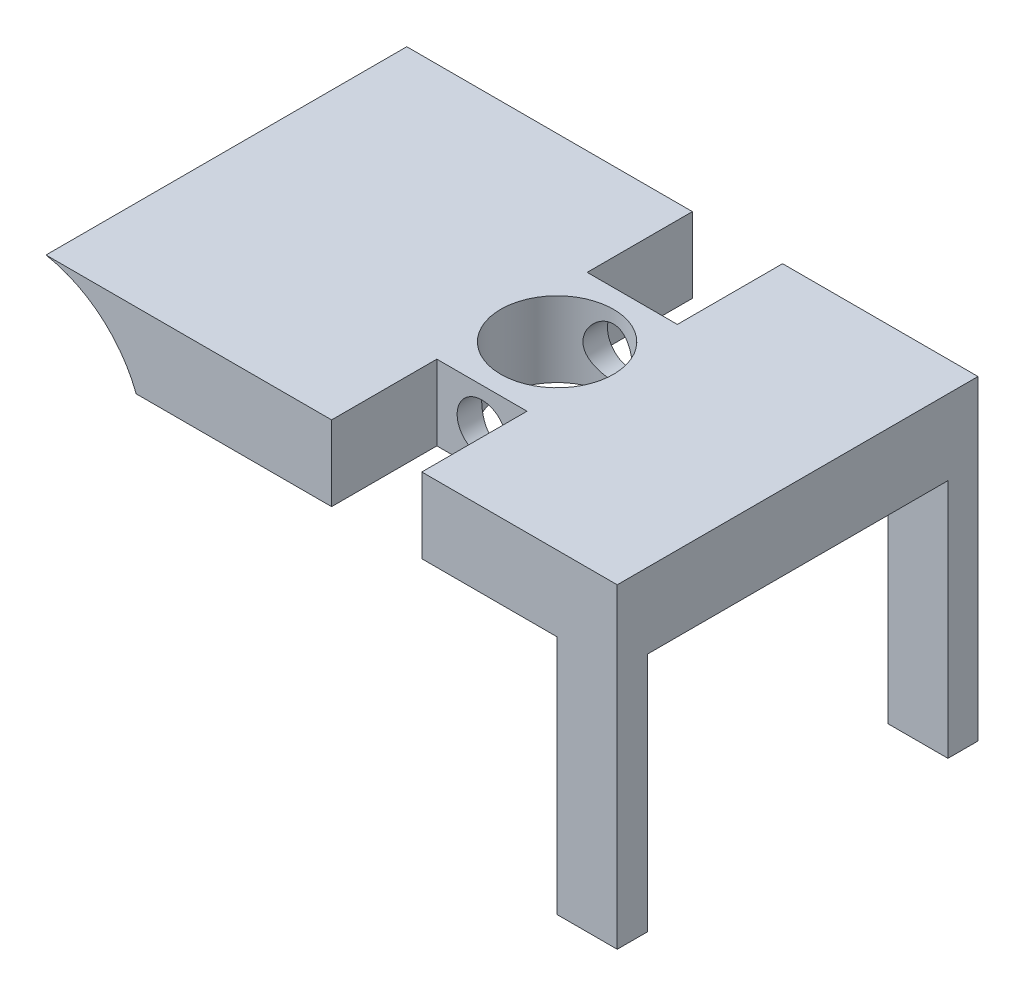
ISO-10303-21;
HEADER;
FILE_DESCRIPTION(('STEP AP214'),'2;1');
FILE_NAME('part.step','',(''),(''),'','','');
FILE_SCHEMA(('AUTOMOTIVE_DESIGN { 1 0 10303 214 1 1 1 1 }'));
ENDSEC;
DATA;
#1=APPLICATION_CONTEXT('core data for automotive mechanical design processes');
#2=APPLICATION_PROTOCOL_DEFINITION('international standard','automotive_design',2000,#1);
#3=PRODUCT_CONTEXT('',#1,'mechanical');
#4=PRODUCT('Part','Part','',(#3));
#5=PRODUCT_RELATED_PRODUCT_CATEGORY('part','',(#4));
#6=PRODUCT_DEFINITION_FORMATION('','',#4);
#7=PRODUCT_DEFINITION_CONTEXT('part definition',#1,'design');
#8=PRODUCT_DEFINITION('design','',#6,#7);
#9=PRODUCT_DEFINITION_SHAPE('','',#8);
#10=(LENGTH_UNIT() NAMED_UNIT(*) SI_UNIT(.MILLI.,.METRE.));
#11=(NAMED_UNIT(*) PLANE_ANGLE_UNIT() SI_UNIT($,.RADIAN.));
#12=(NAMED_UNIT(*) SI_UNIT($,.STERADIAN.) SOLID_ANGLE_UNIT());
#13=UNCERTAINTY_MEASURE_WITH_UNIT(LENGTH_MEASURE(1.E-05),#10,'distance_accuracy_value','');
#14=(GEOMETRIC_REPRESENTATION_CONTEXT(3) GLOBAL_UNCERTAINTY_ASSIGNED_CONTEXT((#13)) GLOBAL_UNIT_ASSIGNED_CONTEXT((#10,
#11,#12)) REPRESENTATION_CONTEXT('',''));
#15=CARTESIAN_POINT('',(0.,0.,0.));
#16=DIRECTION('',(0.,0.,1.));
#17=DIRECTION('',(1.,0.,0.));
#18=AXIS2_PLACEMENT_3D('',#15,#16,#17);
#19=CARTESIAN_POINT('',(15.,-18.5,-28.4924225024706));
#20=DIRECTION('',(-1.,0.,0.));
#21=DIRECTION('',(0.,-1.,0.));
#22=AXIS2_PLACEMENT_3D('',#19,#20,#21);
#23=PLANE('',#22);
#24=DIRECTION('',(0.,-1.,0.));
#25=VECTOR('',#24,1.);
#26=CARTESIAN_POINT('',(15.,-18.5,-10.));
#27=LINE('',#26,#25);
#28=CARTESIAN_POINT('',(15.,-2.50000000000001,-10.));
#29=VERTEX_POINT('',#28);
#30=CARTESIAN_POINT('',(15.,-18.5,-10.));
#31=VERTEX_POINT('',#30);
#32=EDGE_CURVE('E178',#29,#31,#27,.T.);
#33=ORIENTED_EDGE('',*,*,#32,.F.);
#34=DIRECTION('',(0.,0.,1.));
#35=VECTOR('',#34,1.);
#36=CARTESIAN_POINT('',(15.,-2.50000000000001,-28.4924225024706));
#37=LINE('',#36,#35);
#38=CARTESIAN_POINT('',(15.,-2.50000000000001,-12.));
#39=VERTEX_POINT('',#38);
#40=EDGE_CURVE('E203',#39,#29,#37,.T.);
#41=ORIENTED_EDGE('',*,*,#40,.F.);
#42=DIRECTION('',(0.,-1.,0.));
#43=VECTOR('',#42,1.);
#44=CARTESIAN_POINT('',(15.,-18.5,-12.));
#45=LINE('',#44,#43);
#46=CARTESIAN_POINT('',(15.,-18.5,-12.));
#47=VERTEX_POINT('',#46);
#48=EDGE_CURVE('E638',#39,#47,#45,.T.);
#49=ORIENTED_EDGE('',*,*,#48,.T.);
#50=DIRECTION('',(0.,0.,1.));
#51=VECTOR('',#50,1.);
#52=CARTESIAN_POINT('',(15.,-18.5,-28.4924225024706));
#53=LINE('',#52,#51);
#54=EDGE_CURVE('E208',#47,#31,#53,.T.);
#55=ORIENTED_EDGE('',*,*,#54,.T.);
#56=EDGE_LOOP('',(#33,#41,#49,#55));
#57=FACE_BOUND('',#56,.T.);
#58=ADVANCED_FACE('F45',(#57),#23,.T.);
#59=CARTESIAN_POINT('',(19.,-18.5,-28.4924225024706));
#60=DIRECTION('',(0.,-1.,0.));
#61=DIRECTION('',(0.,0.,-1.));
#62=AXIS2_PLACEMENT_3D('',#59,#60,#61);
#63=PLANE('',#62);
#64=DIRECTION('',(-1.,0.,0.));
#65=VECTOR('',#64,1.);
#66=CARTESIAN_POINT('',(19.001,-18.5,-10.));
#67=LINE('',#66,#65);
#68=CARTESIAN_POINT('',(19.,-18.5,-10.));
#69=VERTEX_POINT('',#68);
#70=EDGE_CURVE('E172',#69,#31,#67,.T.);
#71=ORIENTED_EDGE('',*,*,#70,.T.);
#72=ORIENTED_EDGE('',*,*,#54,.F.);
#73=DIRECTION('',(1.,0.,0.));
#74=VECTOR('',#73,1.);
#75=CARTESIAN_POINT('',(19.,-18.5,-12.));
#76=LINE('',#75,#74);
#77=CARTESIAN_POINT('',(19.,-18.5,-12.));
#78=VERTEX_POINT('',#77);
#79=EDGE_CURVE('E197',#47,#78,#76,.T.);
#80=ORIENTED_EDGE('',*,*,#79,.T.);
#81=DIRECTION('',(0.,0.,1.));
#82=VECTOR('',#81,1.);
#83=CARTESIAN_POINT('',(19.,-18.5,-28.4924225024706));
#84=LINE('',#83,#82);
#85=EDGE_CURVE('E190',#78,#69,#84,.T.);
#86=ORIENTED_EDGE('',*,*,#85,.T.);
#87=EDGE_LOOP('',(#71,#72,#80,#86));
#88=FACE_BOUND('',#87,.T.);
#89=ADVANCED_FACE('F196',(#88),#63,.T.);
#90=CARTESIAN_POINT('',(3.,0.,-12.001));
#91=DIRECTION('',(0.,0.,1.));
#92=DIRECTION('',(1.,0.,0.));
#93=AXIS2_PLACEMENT_3D('',#90,#91,#92);
#94=CYLINDRICAL_SURFACE('',#93,1.65);
#95=CARTESIAN_POINT('',(4.65,0.,-3.36749164809655));
#96=CARTESIAN_POINT('',(4.64999591948725,-0.0874743691332407,-3.36749607292385));
#97=CARTESIAN_POINT('',(4.64299960015496,-0.175092773934506,-3.37094939684784));
#98=CARTESIAN_POINT('',(4.61531716545798,-0.347757116865664,-3.38429832583538));
#99=CARTESIAN_POINT('',(4.59459592274656,-0.432795867086384,-3.39421046041475));
#100=CARTESIAN_POINT('',(4.54044870220548,-0.597493099250671,-3.41912171212208));
#101=CARTESIAN_POINT('',(4.50707857419381,-0.677173445386285,-3.43409843617774));
#102=CARTESIAN_POINT('',(4.42874832845569,-0.829783884986511,-3.46741736925901));
#103=CARTESIAN_POINT('',(4.38379002894349,-0.90271503498006,-3.48575905018413));
#104=CARTESIAN_POINT('',(4.28021734567749,-1.04487154765315,-3.52516638479344));
#105=CARTESIAN_POINT('',(4.22091990046756,-1.11357209474114,-3.54633091062051));
#106=CARTESIAN_POINT('',(4.09178303274802,-1.240446840094,-3.5881911575404));
#107=CARTESIAN_POINT('',(4.02193928529622,-1.29861669819959,-3.60888668227713));
#108=CARTESIAN_POINT('',(3.86946484491625,-1.40556708343849,-3.64870271327509));
#109=CARTESIAN_POINT('',(3.78637319615618,-1.45374252984986,-3.66769507829858));
#110=CARTESIAN_POINT('',(3.61227632392994,-1.53520034882064,-3.700736202455));
#111=CARTESIAN_POINT('',(3.52127502438019,-1.56849005628031,-3.71478739560396));
#112=CARTESIAN_POINT('',(3.3394662745173,-1.61728382118505,-3.73565913311448));
#113=CARTESIAN_POINT('',(3.24894589824284,-1.63369687425848,-3.74284752867496));
#114=CARTESIAN_POINT('',(3.06617018053506,-1.65122350001048,-3.75052967187645));
#115=CARTESIAN_POINT('',(2.97391564874558,-1.65234404312534,-3.75102646959465));
#116=CARTESIAN_POINT('',(2.79695735459994,-1.63969762210196,-3.74547519866295));
#117=CARTESIAN_POINT('',(2.71216534970809,-1.6269337501266,-3.739868091581));
#118=CARTESIAN_POINT('',(2.5460705321449,-1.58862001141631,-3.72336083389609));
#119=CARTESIAN_POINT('',(2.46476797823857,-1.56306919822083,-3.71246029148675));
#120=CARTESIAN_POINT('',(2.30645273442336,-1.49962622377595,-3.68619520386884));
#121=CARTESIAN_POINT('',(2.22952453920683,-1.46155151512837,-3.67076501619212));
#122=CARTESIAN_POINT('',(2.08294686925941,-1.37433410623966,-3.63691910801703));
#123=CARTESIAN_POINT('',(2.01330005270581,-1.32518738450649,-3.6185023034251));
#124=CARTESIAN_POINT('',(1.87753504589473,-1.2128170119971,-3.57882020061428));
#125=CARTESIAN_POINT('',(1.81210572269681,-1.14879890575555,-3.5574447595915));
#126=CARTESIAN_POINT('',(1.69259260075723,-1.01070787762528,-3.51528240579217));
#127=CARTESIAN_POINT('',(1.63851423294623,-0.936630170451257,-3.49449577883282));
#128=CARTESIAN_POINT('',(1.54117220405855,-0.776800460066397,-3.45502479534648));
#129=CARTESIAN_POINT('',(1.49843008891747,-0.690699088400839,-3.43645839327868));
#130=CARTESIAN_POINT('',(1.42834028609234,-0.511490455495728,-3.40497856582965));
#131=CARTESIAN_POINT('',(1.40098013157646,-0.418388937355624,-3.39206056440346));
#132=CARTESIAN_POINT('',(1.36429227707905,-0.234744535363258,-3.37451456223478));
#133=CARTESIAN_POINT('',(1.35383875555708,-0.144476988157724,-3.36937064835985));
#134=CARTESIAN_POINT('',(1.34792333452705,0.0366498278836432,-3.3664757487194));
#135=CARTESIAN_POINT('',(1.35245516573099,0.12750883340235,-3.36872167133214));
#136=CARTESIAN_POINT('',(1.37535174013094,0.300038323378441,-3.37981562096985));
#137=CARTESIAN_POINT('',(1.39265374352297,0.381886932345072,-3.3881559621082));
#138=CARTESIAN_POINT('',(1.43914744636585,0.541431160999632,-3.40982287754369));
#139=CARTESIAN_POINT('',(1.46834214737761,0.619125726657328,-3.42315071054923));
#140=CARTESIAN_POINT('',(1.53921629690324,0.772027463841047,-3.45400682275722));
#141=CARTESIAN_POINT('',(1.58139272921155,0.846970827739324,-3.47169539316014));
#142=CARTESIAN_POINT('',(1.6765572613445,0.989101543315076,-3.50907546279441));
#143=CARTESIAN_POINT('',(1.72955038819797,1.05628526590527,-3.5287678911715));
#144=CARTESIAN_POINT('',(1.85062358980462,1.18748477509611,-3.57013856276202));
#145=CARTESIAN_POINT('',(1.9196470398001,1.25062896923803,-3.59183160476859));
#146=CARTESIAN_POINT('',(2.06778238636593,1.36462621623267,-3.63309467060809));
#147=CARTESIAN_POINT('',(2.14689558402023,1.41547768147164,-3.65266442003673));
#148=CARTESIAN_POINT('',(2.31400673932617,1.50362813045694,-3.68771558350776));
#149=CARTESIAN_POINT('',(2.40206664806587,1.54082304607772,-3.70316536765515));
#150=CARTESIAN_POINT('',(2.58405684732281,1.59956776607057,-3.72798894821772));
#151=CARTESIAN_POINT('',(2.67798315090971,1.62112807306508,-3.73736682301229));
#152=CARTESIAN_POINT('',(2.8612978165453,1.64656089333974,-3.74847245839303));
#153=CARTESIAN_POINT('',(2.95048512527525,1.65165818539736,-3.75072963755332));
#154=CARTESIAN_POINT('',(3.12843486064658,1.64739798838614,-3.74885512685435));
#155=CARTESIAN_POINT('',(3.21719737386056,1.63804358240264,-3.74472479968784));
#156=CARTESIAN_POINT('',(3.38782932587363,1.60602123171463,-3.7308324127445));
#157=CARTESIAN_POINT('',(3.46983114363675,1.58394115377816,-3.72131934376771));
#158=CARTESIAN_POINT('',(3.62890956243099,1.52777362465029,-3.69776205916142));
#159=CARTESIAN_POINT('',(3.70598528433432,1.49368403723099,-3.68371703743449));
#160=CARTESIAN_POINT('',(3.8569304617613,1.41274147649752,-3.65162935021383));
#161=CARTESIAN_POINT('',(3.93049119711801,1.36537526372791,-3.63343300227536));
#162=CARTESIAN_POINT('',(4.06894266820481,1.2599369507724,-3.59513976322225));
#163=CARTESIAN_POINT('',(4.13382977719906,1.20186039623367,-3.57504208305736));
#164=CARTESIAN_POINT('',(4.25831260974055,1.07139703994961,-3.53324031823005));
#165=CARTESIAN_POINT('',(4.31711532685678,0.998252385431579,-3.51153178279635));
#166=CARTESIAN_POINT('',(4.42177534917193,0.842529476107375,-3.47047923678989));
#167=CARTESIAN_POINT('',(4.46762474174623,0.759945498298509,-3.45113667556083));
#168=CARTESIAN_POINT('',(4.5449162136947,0.587124299309073,-3.41723991894323));
#169=CARTESIAN_POINT('',(4.57632700235197,0.496870953906535,-3.40269614232787));
#170=CARTESIAN_POINT('',(4.62309555077018,0.311643517725816,-3.38064338773551));
#171=CARTESIAN_POINT('',(4.6385071714776,0.216686400884634,-3.3731108155642));
#172=CARTESIAN_POINT('',(4.64703108329939,0.100998496777646,-3.36894448238601));
#173=CARTESIAN_POINT('',(4.64814335262455,0.0808209970433276,-3.36840080987488));
#174=CARTESIAN_POINT('',(4.64962829144477,0.0404315640214822,-3.3676738770119));
#175=CARTESIAN_POINT('',(4.65000094320723,0.0202196299200062,-3.36749062530128));
#176=CARTESIAN_POINT('',(4.65,0.,-3.36749164809655));
#177=B_SPLINE_CURVE_WITH_KNOTS('',3,(#95,#96,#97,#98,#99,#100,#101,#102,#103,#104,#105,#106,
#107,#108,#109,#110,#111,#112,#113,#114,#115,#116,#117,#118,#119,#120,#121,#122,#123,#124,#125,
#126,#127,#128,#129,#130,#131,#132,#133,#134,#135,#136,#137,#138,#139,#140,#141,#142,#143,#144,
#145,#146,#147,#148,#149,#150,#151,#152,#153,#154,#155,#156,#157,#158,#159,#160,#161,#162,#163,
#164,#165,#166,#167,#168,#169,#170,#171,#172,#173,#174,#175,#176),.UNSPECIFIED.,.T.,.F.,(4,2,2,
2,2,2,2,2,2,2,2,2,2,2,2,2,2,2,2,2,2,2,2,2,2,2,2,2,2,2,2,2,2,2,2,2,2,2,2,2,4),(0.,
0.262337992001349,0.525350015511181,0.787214015160153,1.04903695265106,1.32739302247777,
1.60586355517072,1.89807751150631,2.19014732125288,2.46549872058573,2.74072460857159,
2.9973112845901,3.25391695538524,3.51444216606865,3.77506215572741,4.05582705551463,
4.336725984226,4.62890596840991,4.92084880275994,5.1924046605751,5.46384692437079,
5.71493513596501,5.96608675823259,6.22839495294345,6.49082533337074,6.77759301230099,
7.06439770769602,7.35334470453729,7.64209741960136,7.90880391080322,8.17545351143564,
8.43067328899049,8.68593848747794,8.95289970595717,9.21997220307097,9.50762420315226,
9.79545153931286,10.0838997352209,10.371373694431,10.4320114560409,10.4926506714452),.UNSPECIFIED.);
#178=CARTESIAN_POINT('',(4.65,0.,-3.36749164809655));
#179=VERTEX_POINT('',#178);
#180=EDGE_CURVE('E222',#179,#179,#177,.T.);
#181=ORIENTED_EDGE('',*,*,#180,.F.);
#182=EDGE_LOOP('',(#181));
#183=FACE_BOUND('',#182,.T.);
#184=CARTESIAN_POINT('',(3.,0.,-5.));
#185=DIRECTION('',(0.,0.,1.));
#186=DIRECTION('',(1.,0.,0.));
#187=AXIS2_PLACEMENT_3D('',#184,#185,#186);
#188=CIRCLE('',#187,1.65);
#189=CARTESIAN_POINT('',(4.65,0.,-5.));
#190=VERTEX_POINT('',#189);
#191=EDGE_CURVE('E429',#190,#190,#188,.T.);
#192=ORIENTED_EDGE('',*,*,#191,.F.);
#193=EDGE_LOOP('',(#192));
#194=FACE_BOUND('',#193,.T.);
#195=ADVANCED_FACE('F262',(#183,#194),#94,.F.);
#196=CARTESIAN_POINT('',(3.,-1.64999999999999,3.75));
#197=CARTESIAN_POINT('',(3.08794065243915,-1.6499960382256,3.74999677525689));
#198=CARTESIAN_POINT('',(3.17602118872723,-1.64292811014753,3.7468719189208));
#199=CARTESIAN_POINT('',(3.34965330491862,-1.61493414299232,3.734683166008));
#200=CARTESIAN_POINT('',(3.43519818666942,-1.59397431770863,3.72560479056562));
#201=CARTESIAN_POINT('',(3.60097235797528,-1.53913128450559,3.70247374212791));
#202=CARTESIAN_POINT('',(3.68121929706646,-1.50529382267499,3.68843868963418));
#203=CARTESIAN_POINT('',(3.83481096834596,-1.42585820871192,3.65674015300381));
#204=CARTESIAN_POINT('',(3.90815735131847,-1.38026287916686,3.63907753990429));
#205=CARTESIAN_POINT('',(4.05000163649842,-1.27598104842035,3.60078615738986));
#206=CARTESIAN_POINT('',(4.11807366426439,-1.21675391782858,3.58005322837619));
#207=CARTESIAN_POINT('',(4.2436925761984,-1.08803679555133,3.53837779505836));
#208=CARTESIAN_POINT('',(4.30123331014303,-1.01854084946945,3.51743517577732));
#209=CARTESIAN_POINT('',(4.40737198125606,-0.866527492523994,3.47638120662905));
#210=CARTESIAN_POINT('',(4.45528386928224,-0.783497192018428,3.45638307676996));
#211=CARTESIAN_POINT('',(4.53627172599083,-0.609555260312108,3.4211597332649));
#212=CARTESIAN_POINT('',(4.5693561919984,-0.51864817889096,3.40593178742375));
#213=CARTESIAN_POINT('',(4.61794121689661,-0.336431274272983,3.3831135312385));
#214=CARTESIAN_POINT('',(4.63426566626132,-0.245387501455799,3.37516767353209));
#215=CARTESIAN_POINT('',(4.65143054751148,-0.0615333461945584,3.3668053594707));
#216=CARTESIAN_POINT('',(4.65228100759649,0.0312758530848508,3.36638402671406));
#217=CARTESIAN_POINT('',(4.63908919688508,0.207355873544227,3.3728210640382));
#218=CARTESIAN_POINT('',(4.6263414186449,0.290751689794502,3.37904671722602));
#219=CARTESIAN_POINT('',(4.58850520692875,0.454071225614274,3.39699646382114));
#220=CARTESIAN_POINT('',(4.56341407162607,0.533994180841894,3.40872176101459));
#221=CARTESIAN_POINT('',(4.50110649630305,0.690226926082286,3.43662073577462));
#222=CARTESIAN_POINT('',(4.46363227970244,0.766416489003954,3.45288773136686));
#223=CARTESIAN_POINT('',(4.37780710670809,0.911743878376039,3.48802159021638));
#224=CARTESIAN_POINT('',(4.32945161231713,0.980878745156242,3.50688953691531));
#225=CARTESIAN_POINT('',(4.21783776896922,1.1170679833526,3.54728261097474));
#226=CARTESIAN_POINT('',(4.15359849475329,1.18329659100236,3.56888963165699));
#227=CARTESIAN_POINT('',(4.01473808953318,1.30433611063186,3.61082599340459));
#228=CARTESIAN_POINT('',(3.94011395212262,1.3591437047246,3.63115496199219));
#229=CARTESIAN_POINT('',(3.7798454417349,1.45719190039969,3.66896451776513));
#230=CARTESIAN_POINT('',(3.69394811565676,1.50005943159356,3.68634771561839));
#231=CARTESIAN_POINT('',(3.51519989197508,1.5704390805186,3.71554130843415));
#232=CARTESIAN_POINT('',(3.42235333017466,1.59796068385572,3.72735514522372));
#233=CARTESIAN_POINT('',(3.23921022750968,1.63505304083377,3.74341295596741));
#234=CARTESIAN_POINT('',(3.14917854061997,1.64572966452198,3.74812228788192));
#235=CARTESIAN_POINT('',(2.96849247665595,1.65217171911425,3.75095455785044));
#236=CARTESIAN_POINT('',(2.87783831540075,1.64794208106068,3.74907967398628));
#237=CARTESIAN_POINT('',(2.70390665287527,1.62544881834208,3.73925037459651));
#238=CARTESIAN_POINT('',(2.62050230959726,1.60799437581935,3.73164663418775));
#239=CARTESIAN_POINT('',(2.45791706209694,1.56071027218964,3.71151728629914));
#240=CARTESIAN_POINT('',(2.37873667607145,1.53087909662229,3.69899107649862));
#241=CARTESIAN_POINT('',(2.22404079862632,1.45873229578337,3.66971134498956));
#242=CARTESIAN_POINT('',(2.14871703627142,1.41605581574278,3.65283800179973));
#243=CARTESIAN_POINT('',(2.00602810222664,1.31982329381418,3.61662102234894));
#244=CARTESIAN_POINT('',(1.93866640117435,1.26626253496258,3.5972763164179));
#245=CARTESIAN_POINT('',(1.80819611837274,1.14484038573233,3.55628214760162));
#246=CARTESIAN_POINT('',(1.74584598439285,1.07618271743489,3.53457144282308));
#247=CARTESIAN_POINT('',(1.63330445356359,0.929097206857136,3.49260064747062));
#248=CARTESIAN_POINT('',(1.58311709508679,0.850666132592157,3.47234104026915));
#249=CARTESIAN_POINT('',(1.49540307748589,0.683921591275967,3.43526035744154));
#250=CARTESIAN_POINT('',(1.45817723591055,0.595429542818642,3.4185241503665));
#251=CARTESIAN_POINT('',(1.39950438017547,0.412456963898674,3.39145640297362));
#252=CARTESIAN_POINT('',(1.37804232181517,0.317982236816926,3.38111875766089));
#253=CARTESIAN_POINT('',(1.35307874998712,0.134229339541124,3.36902436868046));
#254=CARTESIAN_POINT('',(1.34822601990919,0.0451768053067916,3.36662264808986));
#255=CARTESIAN_POINT('',(1.35292803694661,-0.132443324028014,3.36892598901368));
#256=CARTESIAN_POINT('',(1.36247987258739,-0.221011013494946,3.37362961438419));
#257=CARTESIAN_POINT('',(1.39454415171674,-0.389834130472378,3.38899632048545));
#258=CARTESIAN_POINT('',(1.41627535473376,-0.470274087988884,3.39929913530276));
#259=CARTESIAN_POINT('',(1.4712672768033,-0.626361280798586,3.42438089295876));
#260=CARTESIAN_POINT('',(1.50453131275969,-0.702007129869665,3.43916112337134));
#261=CARTESIAN_POINT('',(1.58406507679427,-0.851619735953297,3.47269356886383));
#262=CARTESIAN_POINT('',(1.63102681157857,-0.92517449515469,3.49163847278619));
#263=CARTESIAN_POINT('',(1.7357127896172,-1.06377992281055,3.53089238653571));
#264=CARTESIAN_POINT('',(1.79344141213049,-1.12882711256768,3.55120194925799));
#265=CARTESIAN_POINT('',(1.92382903951874,-1.25428003578286,3.59296880703805));
#266=CARTESIAN_POINT('',(1.99734015606777,-1.31382091586416,3.6143768693599));
#267=CARTESIAN_POINT('',(2.15406955877593,-1.41980560454865,3.65423468677977));
#268=CARTESIAN_POINT('',(2.23729223810855,-1.46624345307614,3.67268309400139));
#269=CARTESIAN_POINT('',(2.41023740744422,-1.54387701756613,3.70436408768263));
#270=CARTESIAN_POINT('',(2.49986734754799,-1.57525320509647,3.71765804406783));
#271=CARTESIAN_POINT('',(2.68371482188615,-1.62216171678276,3.73777368374933));
#272=CARTESIAN_POINT('',(2.77791736039553,-1.63774259010252,3.74461519501638));
#273=CARTESIAN_POINT('',(2.89387606102141,-1.64672172070879,3.7485588513459));
#274=CARTESIAN_POINT('',(2.91507632147087,-1.64794995964318,3.74909837906909));
#275=CARTESIAN_POINT('',(2.95751499929637,-1.6495895819625,3.74981934473969));
#276=CARTESIAN_POINT('',(2.97875341705226,-1.65000095717015,3.75000077910238));
#277=CARTESIAN_POINT('',(3.,-1.64999999999999,3.75));
#278=B_SPLINE_CURVE_WITH_KNOTS('',3,(#196,#197,#198,#199,#200,#201,#202,#203,#204,#205,#206,
#207,#208,#209,#210,#211,#212,#213,#214,#215,#216,#217,#218,#219,#220,#221,#222,#223,#224,#225,
#226,#227,#228,#229,#230,#231,#232,#233,#234,#235,#236,#237,#238,#239,#240,#241,#242,#243,#244,
#245,#246,#247,#248,#249,#250,#251,#252,#253,#254,#255,#256,#257,#258,#259,#260,#261,#262,#263,
#264,#265,#266,#267,#268,#269,#270,#271,#272,#273,#274,#275,#276,#277),.UNSPECIFIED.,.T.,.F.,(4,
2,2,2,2,2,2,2,2,2,2,2,2,2,2,2,2,2,2,2,2,2,2,2,2,2,2,2,2,2,2,2,2,2,2,2,2,2,2,2,4),(0.,
0.263734510147988,0.52811280905045,0.791560575603074,1.05494515780487,1.33150079465859,
1.60821742685178,1.90051649596436,2.19264783893791,2.46960925800041,2.74639118079142,
2.99899429642278,3.25165272874969,3.50994222706956,3.76833964437947,4.05135561937525,
4.33445369828947,4.62559874662744,4.91656363268483,5.18748705235547,5.45832085804592,
5.71380105020368,5.96931251303603,6.23280504553125,6.49641201330446,6.78088013255853,
7.06544257396593,7.35622693243306,7.64673341835486,7.91295937269032,8.17913152420861,
8.42991502344918,8.68077070926695,8.94756356427704,9.21446517058845,9.50405959505639,
9.79378553355286,10.0799474542432,10.3652271238324,10.4289451074685,10.4926637289549),.UNSPECIFIED.);
#279=CARTESIAN_POINT('',(3.,-1.64999999999999,3.75));
#280=VERTEX_POINT('',#279);
#281=EDGE_CURVE('E231',#280,#280,#278,.T.);
#282=ORIENTED_EDGE('',*,*,#281,.F.);
#283=EDGE_LOOP('',(#282));
#284=FACE_BOUND('',#283,.T.);
#285=CARTESIAN_POINT('',(3.,0.,5.));
#286=DIRECTION('',(0.,0.,1.));
#287=DIRECTION('',(1.,0.,0.));
#288=AXIS2_PLACEMENT_3D('',#285,#286,#287);
#289=CIRCLE('',#288,1.65);
#290=CARTESIAN_POINT('',(4.65,0.,5.));
#291=VERTEX_POINT('',#290);
#292=EDGE_CURVE('E355',#291,#291,#289,.T.);
#293=ORIENTED_EDGE('',*,*,#292,.T.);
#294=EDGE_LOOP('',(#293));
#295=FACE_BOUND('',#294,.T.);
#296=ADVANCED_FACE('F451',(#284,#295),#94,.F.);
#297=CARTESIAN_POINT('',(-19.,2.50000000000001,12.));
#298=DIRECTION('',(0.,-1.,0.));
#299=DIRECTION('',(1.,0.,0.));
#300=AXIS2_PLACEMENT_3D('',#297,#298,#299);
#301=PLANE('',#300);
#302=CARTESIAN_POINT('',(3.,2.5,0.));
#303=DIRECTION('',(0.,1.,0.));
#304=DIRECTION('',(0.,0.,1.));
#305=AXIS2_PLACEMENT_3D('',#302,#303,#304);
#306=CIRCLE('',#305,3.75);
#307=CARTESIAN_POINT('',(3.,2.5,3.75));
#308=VERTEX_POINT('',#307);
#309=EDGE_CURVE('E214',#308,#308,#306,.T.);
#310=ORIENTED_EDGE('',*,*,#309,.F.);
#311=EDGE_LOOP('',(#310));
#312=FACE_BOUND('',#311,.T.);
#313=DIRECTION('',(0.,0.,-1.));
#314=VECTOR('',#313,1.);
#315=CARTESIAN_POINT('',(0.,2.50000000000001,-5.));
#316=LINE('',#315,#314);
#317=CARTESIAN_POINT('',(0.,2.50000000000001,-5.));
#318=VERTEX_POINT('',#317);
#319=CARTESIAN_POINT('',(0.,2.50000000000001,-12.));
#320=VERTEX_POINT('',#319);
#321=EDGE_CURVE('E338',#318,#320,#316,.T.);
#322=ORIENTED_EDGE('',*,*,#321,.T.);
#323=DIRECTION('',(-1.,0.,0.));
#324=VECTOR('',#323,1.);
#325=CARTESIAN_POINT('',(-19.,2.50000000000001,-12.));
#326=LINE('',#325,#324);
#327=CARTESIAN_POINT('',(-19.,2.50000000000001,-12.));
#328=VERTEX_POINT('',#327);
#329=EDGE_CURVE('E309',#320,#328,#326,.T.);
#330=ORIENTED_EDGE('',*,*,#329,.T.);
#331=DIRECTION('',(0.,0.,-1.));
#332=VECTOR('',#331,1.);
#333=CARTESIAN_POINT('',(-19.,2.50000000000001,12.));
#334=LINE('',#333,#332);
#335=CARTESIAN_POINT('',(-19.,2.50000000000001,12.));
#336=VERTEX_POINT('',#335);
#337=EDGE_CURVE('E54',#336,#328,#334,.T.);
#338=ORIENTED_EDGE('',*,*,#337,.F.);
#339=DIRECTION('',(-1.,0.,0.));
#340=VECTOR('',#339,1.);
#341=CARTESIAN_POINT('',(-19.,2.50000000000001,12.));
#342=LINE('',#341,#340);
#343=CARTESIAN_POINT('',(0.,2.50000000000001,12.));
#344=VERTEX_POINT('',#343);
#345=EDGE_CURVE('E394',#344,#336,#342,.T.);
#346=ORIENTED_EDGE('',*,*,#345,.F.);
#347=DIRECTION('',(0.,0.,1.));
#348=VECTOR('',#347,1.);
#349=CARTESIAN_POINT('',(0.,2.50000000000001,5.));
#350=LINE('',#349,#348);
#351=CARTESIAN_POINT('',(0.,2.50000000000001,5.));
#352=VERTEX_POINT('',#351);
#353=EDGE_CURVE('E330',#352,#344,#350,.T.);
#354=ORIENTED_EDGE('',*,*,#353,.F.);
#355=DIRECTION('',(-1.,0.,0.));
#356=VECTOR('',#355,1.);
#357=CARTESIAN_POINT('',(6.,2.50000000000001,5.));
#358=LINE('',#357,#356);
#359=CARTESIAN_POINT('',(6.,2.50000000000001,5.));
#360=VERTEX_POINT('',#359);
#361=EDGE_CURVE('E373',#360,#352,#358,.T.);
#362=ORIENTED_EDGE('',*,*,#361,.F.);
#363=DIRECTION('',(0.,0.,1.));
#364=VECTOR('',#363,1.);
#365=CARTESIAN_POINT('',(6.,2.50000000000001,5.));
#366=LINE('',#365,#364);
#367=CARTESIAN_POINT('',(6.,2.50000000000001,12.));
#368=VERTEX_POINT('',#367);
#369=EDGE_CURVE('E383',#360,#368,#366,.T.);
#370=ORIENTED_EDGE('',*,*,#369,.T.);
#371=CARTESIAN_POINT('',(19.,2.49999999999999,12.));
#372=VERTEX_POINT('',#371);
#373=EDGE_CURVE('E395',#372,#368,#342,.T.);
#374=ORIENTED_EDGE('',*,*,#373,.F.);
#375=DIRECTION('',(0.,0.,-1.));
#376=VECTOR('',#375,1.);
#377=CARTESIAN_POINT('',(19.,2.49999999999999,12.));
#378=LINE('',#377,#376);
#379=CARTESIAN_POINT('',(19.,2.49999999999999,-12.));
#380=VERTEX_POINT('',#379);
#381=EDGE_CURVE('E11',#372,#380,#378,.T.);
#382=ORIENTED_EDGE('',*,*,#381,.T.);
#383=CARTESIAN_POINT('',(6.,2.5,-12.));
#384=VERTEX_POINT('',#383);
#385=EDGE_CURVE('E285',#380,#384,#326,.T.);
#386=ORIENTED_EDGE('',*,*,#385,.T.);
#387=DIRECTION('',(0.,0.,-1.));
#388=VECTOR('',#387,1.);
#389=CARTESIAN_POINT('',(6.,2.50000000000001,-5.));
#390=LINE('',#389,#388);
#391=CARTESIAN_POINT('',(6.,2.50000000000001,-5.));
#392=VERTEX_POINT('',#391);
#393=EDGE_CURVE('E345',#392,#384,#390,.T.);
#394=ORIENTED_EDGE('',*,*,#393,.F.);
#395=DIRECTION('',(-1.,0.,0.));
#396=VECTOR('',#395,1.);
#397=CARTESIAN_POINT('',(6.,2.50000000000001,-5.));
#398=LINE('',#397,#396);
#399=EDGE_CURVE('E340',#392,#318,#398,.T.);
#400=ORIENTED_EDGE('',*,*,#399,.T.);
#401=EDGE_LOOP('',(#322,#330,#338,#346,#354,#362,#370,#374,#382,#386,#394,#400));
#402=FACE_BOUND('',#401,.T.);
#403=ADVANCED_FACE('F336',(#312,#402),#301,.F.);
#404=CARTESIAN_POINT('',(-13.,-2.50000000000001,12.));
#405=DIRECTION('',(0.,1.,0.));
#406=DIRECTION('',(0.,0.,1.));
#407=AXIS2_PLACEMENT_3D('',#404,#405,#406);
#408=PLANE('',#407);
#409=CARTESIAN_POINT('',(3.,-2.50000000000001,0.));
#410=DIRECTION('',(0.,1.,0.));
#411=DIRECTION('',(0.,0.,1.));
#412=AXIS2_PLACEMENT_3D('',#409,#410,#411);
#413=CIRCLE('',#412,3.75);
#414=CARTESIAN_POINT('',(3.,-2.50000000000001,3.75));
#415=VERTEX_POINT('',#414);
#416=EDGE_CURVE('E218',#415,#415,#413,.F.);
#417=ORIENTED_EDGE('',*,*,#416,.F.);
#418=EDGE_LOOP('',(#417));
#419=FACE_BOUND('',#418,.T.);
#420=DIRECTION('',(1.,0.,0.));
#421=VECTOR('',#420,1.);
#422=CARTESIAN_POINT('',(-13.,-2.50000000000001,-12.));
#423=LINE('',#422,#421);
#424=CARTESIAN_POINT('',(6.,-2.49999999999999,-12.));
#425=VERTEX_POINT('',#424);
#426=EDGE_CURVE('E272',#425,#39,#423,.T.);
#427=ORIENTED_EDGE('',*,*,#426,.T.);
#428=ORIENTED_EDGE('',*,*,#40,.T.);
#429=DIRECTION('',(-1.,0.,0.));
#430=VECTOR('',#429,1.);
#431=CARTESIAN_POINT('',(19.001,-2.50000000000001,-10.));
#432=LINE('',#431,#430);
#433=CARTESIAN_POINT('',(19.,-2.50000000000001,-10.));
#434=VERTEX_POINT('',#433);
#435=EDGE_CURVE('E269',#434,#29,#432,.T.);
#436=ORIENTED_EDGE('',*,*,#435,.F.);
#437=DIRECTION('',(0.,0.,1.));
#438=VECTOR('',#437,1.);
#439=CARTESIAN_POINT('',(19.,-2.50000000000001,-10.));
#440=LINE('',#439,#438);
#441=CARTESIAN_POINT('',(19.,-2.50000000000001,10.));
#442=VERTEX_POINT('',#441);
#443=EDGE_CURVE('E193',#434,#442,#440,.T.);
#444=ORIENTED_EDGE('',*,*,#443,.T.);
#445=DIRECTION('',(-1.,0.,0.));
#446=VECTOR('',#445,1.);
#447=CARTESIAN_POINT('',(19.001,-2.50000000000001,10.));
#448=LINE('',#447,#446);
#449=CARTESIAN_POINT('',(15.,-2.50000000000001,10.));
#450=VERTEX_POINT('',#449);
#451=EDGE_CURVE('E650',#442,#450,#448,.T.);
#452=ORIENTED_EDGE('',*,*,#451,.T.);
#453=CARTESIAN_POINT('',(15.,-2.50000000000001,12.));
#454=VERTEX_POINT('',#453);
#455=EDGE_CURVE('E69',#450,#454,#37,.T.);
#456=ORIENTED_EDGE('',*,*,#455,.T.);
#457=DIRECTION('',(1.,0.,0.));
#458=VECTOR('',#457,1.);
#459=CARTESIAN_POINT('',(-13.,-2.50000000000001,12.));
#460=LINE('',#459,#458);
#461=CARTESIAN_POINT('',(6.,-2.50000000000001,12.));
#462=VERTEX_POINT('',#461);
#463=EDGE_CURVE('E321',#462,#454,#460,.T.);
#464=ORIENTED_EDGE('',*,*,#463,.F.);
#465=DIRECTION('',(0.,0.,1.));
#466=VECTOR('',#465,1.);
#467=CARTESIAN_POINT('',(6.,-2.49999999999999,5.));
#468=LINE('',#467,#466);
#469=CARTESIAN_POINT('',(6.,-2.49999999999999,5.));
#470=VERTEX_POINT('',#469);
#471=EDGE_CURVE('E387',#470,#462,#468,.T.);
#472=ORIENTED_EDGE('',*,*,#471,.F.);
#473=DIRECTION('',(1.,0.,0.));
#474=VECTOR('',#473,1.);
#475=CARTESIAN_POINT('',(6.,-2.49999999999999,5.));
#476=LINE('',#475,#474);
#477=CARTESIAN_POINT('',(0.,-2.49999999999999,5.));
#478=VERTEX_POINT('',#477);
#479=EDGE_CURVE('E364',#478,#470,#476,.T.);
#480=ORIENTED_EDGE('',*,*,#479,.F.);
#481=DIRECTION('',(0.,0.,1.));
#482=VECTOR('',#481,1.);
#483=CARTESIAN_POINT('',(0.,-2.49999999999999,5.));
#484=LINE('',#483,#482);
#485=CARTESIAN_POINT('',(0.,-2.49999999999999,12.));
#486=VERTEX_POINT('',#485);
#487=EDGE_CURVE('E317',#478,#486,#484,.T.);
#488=ORIENTED_EDGE('',*,*,#487,.T.);
#489=CARTESIAN_POINT('',(-13.,-2.50000000000001,12.));
#490=VERTEX_POINT('',#489);
#491=EDGE_CURVE('E292',#490,#486,#460,.T.);
#492=ORIENTED_EDGE('',*,*,#491,.F.);
#493=DIRECTION('',(0.,0.,-1.));
#494=VECTOR('',#493,1.);
#495=CARTESIAN_POINT('',(-13.,-2.50000000000001,12.));
#496=LINE('',#495,#494);
#497=CARTESIAN_POINT('',(-13.,-2.50000000000001,-12.));
#498=VERTEX_POINT('',#497);
#499=EDGE_CURVE('E289',#490,#498,#496,.T.);
#500=ORIENTED_EDGE('',*,*,#499,.T.);
#501=CARTESIAN_POINT('',(0.,-2.49999999999999,-12.));
#502=VERTEX_POINT('',#501);
#503=EDGE_CURVE('E278',#498,#502,#423,.T.);
#504=ORIENTED_EDGE('',*,*,#503,.T.);
#505=DIRECTION('',(0.,0.,-1.));
#506=VECTOR('',#505,1.);
#507=CARTESIAN_POINT('',(0.,-2.49999999999999,-5.));
#508=LINE('',#507,#506);
#509=CARTESIAN_POINT('',(0.,-2.49999999999999,-5.));
#510=VERTEX_POINT('',#509);
#511=EDGE_CURVE('E312',#510,#502,#508,.T.);
#512=ORIENTED_EDGE('',*,*,#511,.F.);
#513=DIRECTION('',(1.,0.,0.));
#514=VECTOR('',#513,1.);
#515=CARTESIAN_POINT('',(6.,-2.49999999999999,-5.));
#516=LINE('',#515,#514);
#517=CARTESIAN_POINT('',(6.,-2.49999999999999,-5.));
#518=VERTEX_POINT('',#517);
#519=EDGE_CURVE('E346',#510,#518,#516,.T.);
#520=ORIENTED_EDGE('',*,*,#519,.T.);
#521=DIRECTION('',(0.,0.,-1.));
#522=VECTOR('',#521,1.);
#523=CARTESIAN_POINT('',(6.,-2.49999999999999,-5.));
#524=LINE('',#523,#522);
#525=EDGE_CURVE('E274',#518,#425,#524,.T.);
#526=ORIENTED_EDGE('',*,*,#525,.T.);
#527=EDGE_LOOP('',(#427,#428,#436,#444,#452,#456,#464,#472,#480,#488,#492,#500,#504,#512,#520,#526));
#528=FACE_BOUND('',#527,.T.);
#529=ADVANCED_FACE('F268',(#419,#528),#408,.F.);
#530=CARTESIAN_POINT('',(-20.4698443145955,-5.36381317751454,-12.));
#531=DIRECTION('',(0.,0.,-1.));
#532=DIRECTION('',(-1.,0.,0.));
#533=AXIS2_PLACEMENT_3D('',#530,#531,#532);
#534=PLANE('',#533);
#535=ORIENTED_EDGE('',*,*,#329,.F.);
#536=DIRECTION('',(0.,-1.,0.));
#537=VECTOR('',#536,1.);
#538=CARTESIAN_POINT('',(0.,-2.49999999999999,-12.));
#539=LINE('',#538,#537);
#540=EDGE_CURVE('E310',#320,#502,#539,.T.);
#541=ORIENTED_EDGE('',*,*,#540,.T.);
#542=ORIENTED_EDGE('',*,*,#503,.F.);
#543=CARTESIAN_POINT('',(-20.4698443145955,-5.36381317751454,-12.));
#544=DIRECTION('',(0.,0.,-1.));
#545=DIRECTION('',(-1.,0.,0.));
#546=AXIS2_PLACEMENT_3D('',#543,#544,#545);
#547=CIRCLE('',#546,8.);
#548=EDGE_CURVE('E279',#328,#498,#547,.T.);
#549=ORIENTED_EDGE('',*,*,#548,.F.);
#550=EDGE_LOOP('',(#535,#541,#542,#549));
#551=FACE_BOUND('',#550,.T.);
#552=ADVANCED_FACE('F307',(#551),#534,.T.);
#553=ORIENTED_EDGE('',*,*,#426,.F.);
#554=DIRECTION('',(0.,1.,0.));
#555=VECTOR('',#554,1.);
#556=CARTESIAN_POINT('',(6.,-2.49999999999999,-12.));
#557=LINE('',#556,#555);
#558=EDGE_CURVE('E421',#425,#384,#557,.T.);
#559=ORIENTED_EDGE('',*,*,#558,.T.);
#560=ORIENTED_EDGE('',*,*,#385,.F.);
#561=DIRECTION('',(0.,1.,0.));
#562=VECTOR('',#561,1.);
#563=CARTESIAN_POINT('',(19.,-2.50000000000001,-12.));
#564=LINE('',#563,#562);
#565=EDGE_CURVE('E328',#78,#380,#564,.T.);
#566=ORIENTED_EDGE('',*,*,#565,.F.);
#567=ORIENTED_EDGE('',*,*,#79,.F.);
#568=ORIENTED_EDGE('',*,*,#48,.F.);
#569=EDGE_LOOP('',(#553,#559,#560,#566,#567,#568));
#570=FACE_BOUND('',#569,.T.);
#571=ADVANCED_FACE('F420',(#570),#534,.T.);
#572=CARTESIAN_POINT('',(-20.4698443145955,-5.36381317751454,12.));
#573=DIRECTION('',(0.,0.,-1.));
#574=DIRECTION('',(-1.,0.,0.));
#575=AXIS2_PLACEMENT_3D('',#572,#573,#574);
#576=PLANE('',#575);
#577=ORIENTED_EDGE('',*,*,#491,.T.);
#578=DIRECTION('',(0.,-1.,0.));
#579=VECTOR('',#578,1.);
#580=CARTESIAN_POINT('',(0.,-2.49999999999999,12.));
#581=LINE('',#580,#579);
#582=EDGE_CURVE('E359',#344,#486,#581,.T.);
#583=ORIENTED_EDGE('',*,*,#582,.F.);
#584=ORIENTED_EDGE('',*,*,#345,.T.);
#585=CARTESIAN_POINT('',(-20.4698443145955,-5.36381317751454,12.));
#586=DIRECTION('',(0.,0.,-1.));
#587=DIRECTION('',(-1.,0.,0.));
#588=AXIS2_PLACEMENT_3D('',#585,#586,#587);
#589=CIRCLE('',#588,8.);
#590=EDGE_CURVE('E301',#336,#490,#589,.T.);
#591=ORIENTED_EDGE('',*,*,#590,.T.);
#592=EDGE_LOOP('',(#577,#583,#584,#591));
#593=FACE_BOUND('',#592,.T.);
#594=ADVANCED_FACE('F402',(#593),#576,.F.);
#595=CARTESIAN_POINT('',(19.,-2.50000000000001,12.));
#596=DIRECTION('',(-1.,0.,0.));
#597=DIRECTION('',(0.,0.,1.));
#598=AXIS2_PLACEMENT_3D('',#595,#596,#597);
#599=PLANE('',#598);
#600=ORIENTED_EDGE('',*,*,#443,.F.);
#601=DIRECTION('',(0.,1.,0.));
#602=VECTOR('',#601,1.);
#603=CARTESIAN_POINT('',(19.,-18.5,-10.));
#604=LINE('',#603,#602);
#605=EDGE_CURVE('E175',#69,#434,#604,.T.);
#606=ORIENTED_EDGE('',*,*,#605,.F.);
#607=ORIENTED_EDGE('',*,*,#85,.F.);
#608=ORIENTED_EDGE('',*,*,#565,.T.);
#609=ORIENTED_EDGE('',*,*,#381,.F.);
#610=DIRECTION('',(0.,1.,0.));
#611=VECTOR('',#610,1.);
#612=CARTESIAN_POINT('',(19.,-2.50000000000001,12.));
#613=LINE('',#612,#611);
#614=CARTESIAN_POINT('',(19.,-18.5,12.));
#615=VERTEX_POINT('',#614);
#616=EDGE_CURVE('E284',#615,#372,#613,.T.);
#617=ORIENTED_EDGE('',*,*,#616,.F.);
#618=CARTESIAN_POINT('',(19.,-18.5,10.));
#619=VERTEX_POINT('',#618);
#620=EDGE_CURVE('E199',#619,#615,#84,.T.);
#621=ORIENTED_EDGE('',*,*,#620,.F.);
#622=DIRECTION('',(0.,-1.,0.));
#623=VECTOR('',#622,1.);
#624=CARTESIAN_POINT('',(19.,-18.5,10.));
#625=LINE('',#624,#623);
#626=EDGE_CURVE('E61',#442,#619,#625,.T.);
#627=ORIENTED_EDGE('',*,*,#626,.F.);
#628=EDGE_LOOP('',(#600,#606,#607,#608,#609,#617,#621,#627));
#629=FACE_BOUND('',#628,.T.);
#630=ADVANCED_FACE('F47',(#629),#599,.F.);
#631=CARTESIAN_POINT('',(-20.4698443145955,-5.36381317751454,12.));
#632=DIRECTION('',(0.,0.,-1.));
#633=DIRECTION('',(-1.,0.,0.));
#634=AXIS2_PLACEMENT_3D('',#631,#632,#633);
#635=CYLINDRICAL_SURFACE('',#634,8.);
#636=ORIENTED_EDGE('',*,*,#548,.T.);
#637=ORIENTED_EDGE('',*,*,#499,.F.);
#638=ORIENTED_EDGE('',*,*,#590,.F.);
#639=ORIENTED_EDGE('',*,*,#337,.T.);
#640=EDGE_LOOP('',(#636,#637,#638,#639));
#641=FACE_BOUND('',#640,.T.);
#642=ADVANCED_FACE('F299',(#641),#635,.F.);
#643=ORIENTED_EDGE('',*,*,#373,.T.);
#644=DIRECTION('',(0.,1.,0.));
#645=VECTOR('',#644,1.);
#646=CARTESIAN_POINT('',(6.,-2.49999999999999,12.));
#647=LINE('',#646,#645);
#648=EDGE_CURVE('E365',#462,#368,#647,.T.);
#649=ORIENTED_EDGE('',*,*,#648,.F.);
#650=ORIENTED_EDGE('',*,*,#463,.T.);
#651=DIRECTION('',(0.,-1.,0.));
#652=VECTOR('',#651,1.);
#653=CARTESIAN_POINT('',(15.,-18.5,12.));
#654=LINE('',#653,#652);
#655=CARTESIAN_POINT('',(15.,-18.5,12.));
#656=VERTEX_POINT('',#655);
#657=EDGE_CURVE('E643',#454,#656,#654,.T.);
#658=ORIENTED_EDGE('',*,*,#657,.T.);
#659=DIRECTION('',(1.,0.,0.));
#660=VECTOR('',#659,1.);
#661=CARTESIAN_POINT('',(19.,-18.5,12.));
#662=LINE('',#661,#660);
#663=EDGE_CURVE('E418',#656,#615,#662,.T.);
#664=ORIENTED_EDGE('',*,*,#663,.T.);
#665=ORIENTED_EDGE('',*,*,#616,.T.);
#666=EDGE_LOOP('',(#643,#649,#650,#658,#664,#665));
#667=FACE_BOUND('',#666,.T.);
#668=ADVANCED_FACE('F415',(#667),#576,.F.);
#669=CARTESIAN_POINT('',(0.,-2.49999999999999,5.));
#670=DIRECTION('',(-1.,0.,0.));
#671=DIRECTION('',(0.,0.,1.));
#672=AXIS2_PLACEMENT_3D('',#669,#670,#671);
#673=PLANE('',#672);
#674=ORIENTED_EDGE('',*,*,#582,.T.);
#675=ORIENTED_EDGE('',*,*,#487,.F.);
#676=DIRECTION('',(0.,-1.,0.));
#677=VECTOR('',#676,1.);
#678=CARTESIAN_POINT('',(0.,-2.49999999999999,5.));
#679=LINE('',#678,#677);
#680=EDGE_CURVE('E360',#352,#478,#679,.T.);
#681=ORIENTED_EDGE('',*,*,#680,.F.);
#682=ORIENTED_EDGE('',*,*,#353,.T.);
#683=EDGE_LOOP('',(#674,#675,#681,#682));
#684=FACE_BOUND('',#683,.T.);
#685=ADVANCED_FACE('F406',(#684),#673,.F.);
#686=CARTESIAN_POINT('',(6.,-2.49999999999999,5.));
#687=DIRECTION('',(1.,0.,0.));
#688=DIRECTION('',(0.,1.,0.));
#689=AXIS2_PLACEMENT_3D('',#686,#687,#688);
#690=PLANE('',#689);
#691=ORIENTED_EDGE('',*,*,#648,.T.);
#692=ORIENTED_EDGE('',*,*,#369,.F.);
#693=DIRECTION('',(0.,1.,0.));
#694=VECTOR('',#693,1.);
#695=CARTESIAN_POINT('',(6.,-2.49999999999999,5.));
#696=LINE('',#695,#694);
#697=EDGE_CURVE('E369',#470,#360,#696,.T.);
#698=ORIENTED_EDGE('',*,*,#697,.F.);
#699=ORIENTED_EDGE('',*,*,#471,.T.);
#700=EDGE_LOOP('',(#691,#692,#698,#699));
#701=FACE_BOUND('',#700,.T.);
#702=ADVANCED_FACE('F411',(#701),#690,.F.);
#703=CARTESIAN_POINT('',(0.,0.,5.));
#704=DIRECTION('',(0.,0.,1.));
#705=DIRECTION('',(1.,0.,0.));
#706=AXIS2_PLACEMENT_3D('',#703,#704,#705);
#707=PLANE('',#706);
#708=ORIENTED_EDGE('',*,*,#292,.F.);
#709=EDGE_LOOP('',(#708));
#710=FACE_BOUND('',#709,.T.);
#711=ORIENTED_EDGE('',*,*,#680,.T.);
#712=ORIENTED_EDGE('',*,*,#479,.T.);
#713=ORIENTED_EDGE('',*,*,#697,.T.);
#714=ORIENTED_EDGE('',*,*,#361,.T.);
#715=EDGE_LOOP('',(#711,#712,#713,#714));
#716=FACE_BOUND('',#715,.T.);
#717=ADVANCED_FACE('F408',(#710,#716),#707,.T.);
#718=CARTESIAN_POINT('',(0.,0.,-5.));
#719=DIRECTION('',(0.,0.,-1.));
#720=DIRECTION('',(1.,0.,0.));
#721=AXIS2_PLACEMENT_3D('',#718,#719,#720);
#722=PLANE('',#721);
#723=DIRECTION('',(0.,-1.,0.));
#724=VECTOR('',#723,1.);
#725=CARTESIAN_POINT('',(0.,-2.49999999999999,-5.));
#726=LINE('',#725,#724);
#727=EDGE_CURVE('E424',#318,#510,#726,.T.);
#728=ORIENTED_EDGE('',*,*,#727,.F.);
#729=ORIENTED_EDGE('',*,*,#399,.F.);
#730=DIRECTION('',(0.,1.,0.));
#731=VECTOR('',#730,1.);
#732=CARTESIAN_POINT('',(6.,-2.49999999999999,-5.));
#733=LINE('',#732,#731);
#734=EDGE_CURVE('E351',#518,#392,#733,.T.);
#735=ORIENTED_EDGE('',*,*,#734,.F.);
#736=ORIENTED_EDGE('',*,*,#519,.F.);
#737=EDGE_LOOP('',(#728,#729,#735,#736));
#738=FACE_BOUND('',#737,.T.);
#739=ORIENTED_EDGE('',*,*,#191,.T.);
#740=EDGE_LOOP('',(#739));
#741=FACE_BOUND('',#740,.T.);
#742=ADVANCED_FACE('F436',(#738,#741),#722,.T.);
#743=CARTESIAN_POINT('',(0.,-2.49999999999999,-5.));
#744=DIRECTION('',(1.,0.,0.));
#745=DIRECTION('',(0.,0.,-1.));
#746=AXIS2_PLACEMENT_3D('',#743,#744,#745);
#747=PLANE('',#746);
#748=ORIENTED_EDGE('',*,*,#540,.F.);
#749=ORIENTED_EDGE('',*,*,#321,.F.);
#750=ORIENTED_EDGE('',*,*,#727,.T.);
#751=ORIENTED_EDGE('',*,*,#511,.T.);
#752=EDGE_LOOP('',(#748,#749,#750,#751));
#753=FACE_BOUND('',#752,.T.);
#754=ADVANCED_FACE('F434',(#753),#747,.T.);
#755=CARTESIAN_POINT('',(6.,-2.49999999999999,-5.));
#756=DIRECTION('',(-1.,0.,0.));
#757=DIRECTION('',(0.,-1.,0.));
#758=AXIS2_PLACEMENT_3D('',#755,#756,#757);
#759=PLANE('',#758);
#760=ORIENTED_EDGE('',*,*,#558,.F.);
#761=ORIENTED_EDGE('',*,*,#525,.F.);
#762=ORIENTED_EDGE('',*,*,#734,.T.);
#763=ORIENTED_EDGE('',*,*,#393,.T.);
#764=EDGE_LOOP('',(#760,#761,#762,#763));
#765=FACE_BOUND('',#764,.T.);
#766=ADVANCED_FACE('F484',(#765),#759,.T.);
#767=CARTESIAN_POINT('',(3.,-2.50100000000001,0.));
#768=DIRECTION('',(0.,1.,0.));
#769=DIRECTION('',(0.,0.,1.));
#770=AXIS2_PLACEMENT_3D('',#767,#768,#769);
#771=CYLINDRICAL_SURFACE('',#770,3.75);
#772=ORIENTED_EDGE('',*,*,#309,.T.);
#773=EDGE_LOOP('',(#772));
#774=FACE_BOUND('',#773,.T.);
#775=ORIENTED_EDGE('',*,*,#416,.T.);
#776=EDGE_LOOP('',(#775));
#777=FACE_BOUND('',#776,.T.);
#778=ORIENTED_EDGE('',*,*,#180,.T.);
#779=EDGE_LOOP('',(#778));
#780=FACE_BOUND('',#779,.T.);
#781=ORIENTED_EDGE('',*,*,#281,.T.);
#782=EDGE_LOOP('',(#781));
#783=FACE_BOUND('',#782,.T.);
#784=ADVANCED_FACE('F236',(#774,#777,#780,#783),#771,.F.);
#785=DIRECTION('',(0.,1.,0.));
#786=VECTOR('',#785,1.);
#787=CARTESIAN_POINT('',(15.,-18.5,10.));
#788=LINE('',#787,#786);
#789=CARTESIAN_POINT('',(15.,-18.5,10.));
#790=VERTEX_POINT('',#789);
#791=EDGE_CURVE('E185',#790,#450,#788,.T.);
#792=ORIENTED_EDGE('',*,*,#791,.F.);
#793=EDGE_CURVE('E210',#790,#656,#53,.T.);
#794=ORIENTED_EDGE('',*,*,#793,.T.);
#795=ORIENTED_EDGE('',*,*,#657,.F.);
#796=ORIENTED_EDGE('',*,*,#455,.F.);
#797=EDGE_LOOP('',(#792,#794,#795,#796));
#798=FACE_BOUND('',#797,.T.);
#799=ADVANCED_FACE('F241',(#798),#23,.T.);
#800=DIRECTION('',(-1.,0.,0.));
#801=VECTOR('',#800,1.);
#802=CARTESIAN_POINT('',(19.001,-18.5,10.));
#803=LINE('',#802,#801);
#804=EDGE_CURVE('E184',#619,#790,#803,.T.);
#805=ORIENTED_EDGE('',*,*,#804,.F.);
#806=ORIENTED_EDGE('',*,*,#620,.T.);
#807=ORIENTED_EDGE('',*,*,#663,.F.);
#808=ORIENTED_EDGE('',*,*,#793,.F.);
#809=EDGE_LOOP('',(#805,#806,#807,#808));
#810=FACE_BOUND('',#809,.T.);
#811=ADVANCED_FACE('F245',(#810),#63,.T.);
#812=CARTESIAN_POINT('',(19.001,-18.5,-10.));
#813=DIRECTION('',(0.,0.,-1.));
#814=DIRECTION('',(-1.,0.,0.));
#815=AXIS2_PLACEMENT_3D('',#812,#813,#814);
#816=PLANE('',#815);
#817=ORIENTED_EDGE('',*,*,#605,.T.);
#818=ORIENTED_EDGE('',*,*,#435,.T.);
#819=ORIENTED_EDGE('',*,*,#32,.T.);
#820=ORIENTED_EDGE('',*,*,#70,.F.);
#821=EDGE_LOOP('',(#817,#818,#819,#820));
#822=FACE_BOUND('',#821,.T.);
#823=ADVANCED_FACE('F174',(#822),#816,.F.);
#824=CARTESIAN_POINT('',(19.001,-18.5,10.));
#825=DIRECTION('',(0.,0.,1.));
#826=DIRECTION('',(1.,0.,0.));
#827=AXIS2_PLACEMENT_3D('',#824,#825,#826);
#828=PLANE('',#827);
#829=ORIENTED_EDGE('',*,*,#626,.T.);
#830=ORIENTED_EDGE('',*,*,#804,.T.);
#831=ORIENTED_EDGE('',*,*,#791,.T.);
#832=ORIENTED_EDGE('',*,*,#451,.F.);
#833=EDGE_LOOP('',(#829,#830,#831,#832));
#834=FACE_BOUND('',#833,.T.);
#835=ADVANCED_FACE('F252',(#834),#828,.F.);
#836=CLOSED_SHELL('',(#58,#89,#195,#296,#403,#529,#552,#571,#594,#630,#642,#668,#685,#702,#717,
#742,#754,#766,#784,#799,#811,#823,#835));
#837=MANIFOLD_SOLID_BREP('B2',#836);
#838=ADVANCED_BREP_SHAPE_REPRESENTATION('',(#18,#837),#14);
#839=SHAPE_DEFINITION_REPRESENTATION(#9,#838);
ENDSEC;
END-ISO-10303-21;
